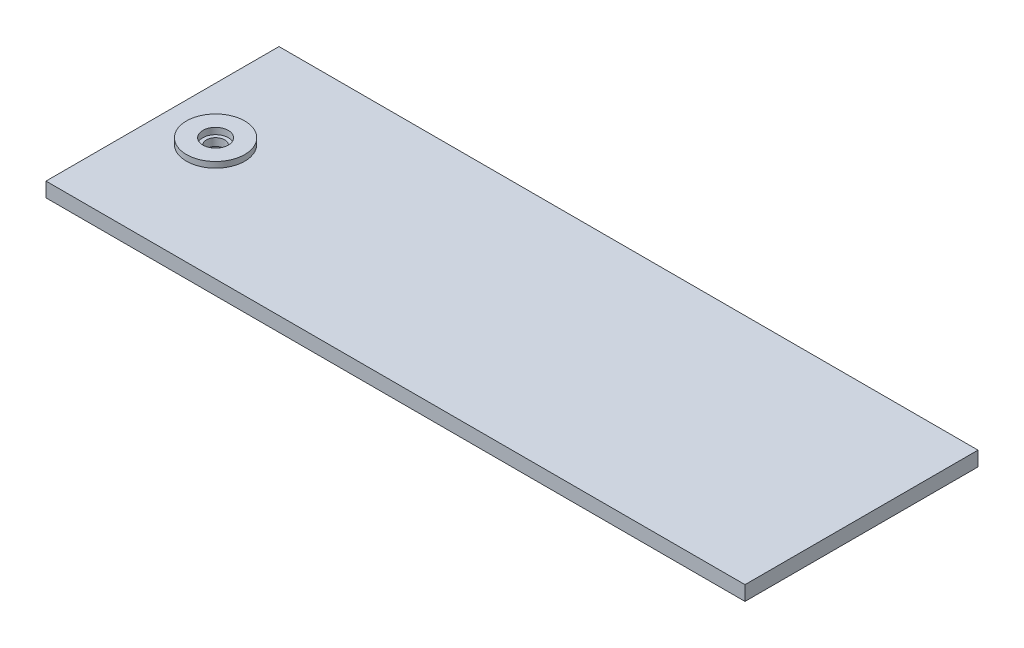
ISO-10303-21;
HEADER;
FILE_DESCRIPTION(('STEP AP214'),'2;1');
FILE_NAME('part.step','',(''),(''),'','','');
FILE_SCHEMA(('AUTOMOTIVE_DESIGN { 1 0 10303 214 1 1 1 1 }'));
ENDSEC;
DATA;
#1=APPLICATION_CONTEXT('core data for automotive mechanical design processes');
#2=APPLICATION_PROTOCOL_DEFINITION('international standard','automotive_design',2000,#1);
#3=PRODUCT_CONTEXT('',#1,'mechanical');
#4=PRODUCT('Part','Part','',(#3));
#5=PRODUCT_RELATED_PRODUCT_CATEGORY('part','',(#4));
#6=PRODUCT_DEFINITION_FORMATION('','',#4);
#7=PRODUCT_DEFINITION_CONTEXT('part definition',#1,'design');
#8=PRODUCT_DEFINITION('design','',#6,#7);
#9=PRODUCT_DEFINITION_SHAPE('','',#8);
#10=(LENGTH_UNIT() NAMED_UNIT(*) SI_UNIT(.MILLI.,.METRE.));
#11=(NAMED_UNIT(*) PLANE_ANGLE_UNIT() SI_UNIT($,.RADIAN.));
#12=(NAMED_UNIT(*) SI_UNIT($,.STERADIAN.) SOLID_ANGLE_UNIT());
#13=UNCERTAINTY_MEASURE_WITH_UNIT(LENGTH_MEASURE(1.E-05),#10,'distance_accuracy_value','');
#14=(GEOMETRIC_REPRESENTATION_CONTEXT(3) GLOBAL_UNCERTAINTY_ASSIGNED_CONTEXT((#13)) GLOBAL_UNIT_ASSIGNED_CONTEXT((#10,
#11,#12)) REPRESENTATION_CONTEXT('',''));
#15=CARTESIAN_POINT('',(0.,0.,0.));
#16=DIRECTION('',(0.,0.,1.));
#17=DIRECTION('',(1.,0.,0.));
#18=AXIS2_PLACEMENT_3D('',#15,#16,#17);
#19=CARTESIAN_POINT('',(304.8,12.7,101.6));
#20=DIRECTION('',(-1.,0.,0.));
#21=DIRECTION('',(0.,0.,1.));
#22=AXIS2_PLACEMENT_3D('',#19,#20,#21);
#23=PLANE('',#22);
#24=DIRECTION('',(0.,0.,-1.));
#25=VECTOR('',#24,1.);
#26=CARTESIAN_POINT('',(304.8,0.,101.6));
#27=LINE('',#26,#25);
#28=CARTESIAN_POINT('',(304.8,0.,101.6));
#29=VERTEX_POINT('',#28);
#30=CARTESIAN_POINT('',(304.8,0.,-101.6));
#31=VERTEX_POINT('',#30);
#32=EDGE_CURVE('E111',#29,#31,#27,.T.);
#33=ORIENTED_EDGE('',*,*,#32,.T.);
#34=DIRECTION('',(0.,-1.,0.));
#35=VECTOR('',#34,1.);
#36=CARTESIAN_POINT('',(304.8,12.7,-101.6));
#37=LINE('',#36,#35);
#38=CARTESIAN_POINT('',(304.8,12.7,-101.6));
#39=VERTEX_POINT('',#38);
#40=EDGE_CURVE('E49',#39,#31,#37,.T.);
#41=ORIENTED_EDGE('',*,*,#40,.F.);
#42=DIRECTION('',(0.,0.,-1.));
#43=VECTOR('',#42,1.);
#44=CARTESIAN_POINT('',(304.8,12.7,101.6));
#45=LINE('',#44,#43);
#46=CARTESIAN_POINT('',(304.8,12.7,101.6));
#47=VERTEX_POINT('',#46);
#48=EDGE_CURVE('E93',#47,#39,#45,.T.);
#49=ORIENTED_EDGE('',*,*,#48,.F.);
#50=DIRECTION('',(0.,-1.,0.));
#51=VECTOR('',#50,1.);
#52=CARTESIAN_POINT('',(304.8,12.7,101.6));
#53=LINE('',#52,#51);
#54=EDGE_CURVE('E107',#47,#29,#53,.T.);
#55=ORIENTED_EDGE('',*,*,#54,.T.);
#56=EDGE_LOOP('',(#33,#41,#49,#55));
#57=FACE_BOUND('',#56,.T.);
#58=ADVANCED_FACE('F39',(#57),#23,.F.);
#59=CARTESIAN_POINT('',(-304.8,12.7,-101.6));
#60=DIRECTION('',(0.,0.,1.));
#61=DIRECTION('',(1.,0.,0.));
#62=AXIS2_PLACEMENT_3D('',#59,#60,#61);
#63=PLANE('',#62);
#64=DIRECTION('',(-1.,0.,0.));
#65=VECTOR('',#64,1.);
#66=CARTESIAN_POINT('',(-304.8,0.,-101.6));
#67=LINE('',#66,#65);
#68=CARTESIAN_POINT('',(-304.8,0.,-101.6));
#69=VERTEX_POINT('',#68);
#70=EDGE_CURVE('E99',#31,#69,#67,.T.);
#71=ORIENTED_EDGE('',*,*,#70,.T.);
#72=DIRECTION('',(0.,-1.,0.));
#73=VECTOR('',#72,1.);
#74=CARTESIAN_POINT('',(-304.8,12.7,-101.6));
#75=LINE('',#74,#73);
#76=CARTESIAN_POINT('',(-304.8,12.7,-101.6));
#77=VERTEX_POINT('',#76);
#78=EDGE_CURVE('E97',#77,#69,#75,.T.);
#79=ORIENTED_EDGE('',*,*,#78,.F.);
#80=DIRECTION('',(-1.,0.,0.));
#81=VECTOR('',#80,1.);
#82=CARTESIAN_POINT('',(-304.8,12.7,-101.6));
#83=LINE('',#82,#81);
#84=EDGE_CURVE('E88',#39,#77,#83,.T.);
#85=ORIENTED_EDGE('',*,*,#84,.F.);
#86=ORIENTED_EDGE('',*,*,#40,.T.);
#87=EDGE_LOOP('',(#71,#79,#85,#86));
#88=FACE_BOUND('',#87,.T.);
#89=ADVANCED_FACE('F98',(#88),#63,.F.);
#90=CARTESIAN_POINT('',(-304.8,12.7,101.6));
#91=DIRECTION('',(1.,0.,0.));
#92=DIRECTION('',(0.,0.,-1.));
#93=AXIS2_PLACEMENT_3D('',#90,#91,#92);
#94=PLANE('',#93);
#95=DIRECTION('',(0.,0.,1.));
#96=VECTOR('',#95,1.);
#97=CARTESIAN_POINT('',(-304.8,0.,101.6));
#98=LINE('',#97,#96);
#99=CARTESIAN_POINT('',(-304.8,0.,101.6));
#100=VERTEX_POINT('',#99);
#101=EDGE_CURVE('E74',#69,#100,#98,.T.);
#102=ORIENTED_EDGE('',*,*,#101,.T.);
#103=DIRECTION('',(0.,-1.,0.));
#104=VECTOR('',#103,1.);
#105=CARTESIAN_POINT('',(-304.8,12.7,101.6));
#106=LINE('',#105,#104);
#107=CARTESIAN_POINT('',(-304.8,12.7,101.6));
#108=VERTEX_POINT('',#107);
#109=EDGE_CURVE('E101',#108,#100,#106,.T.);
#110=ORIENTED_EDGE('',*,*,#109,.F.);
#111=DIRECTION('',(0.,0.,1.));
#112=VECTOR('',#111,1.);
#113=CARTESIAN_POINT('',(-304.8,12.7,101.6));
#114=LINE('',#113,#112);
#115=EDGE_CURVE('E91',#77,#108,#114,.T.);
#116=ORIENTED_EDGE('',*,*,#115,.F.);
#117=ORIENTED_EDGE('',*,*,#78,.T.);
#118=EDGE_LOOP('',(#102,#110,#116,#117));
#119=FACE_BOUND('',#118,.T.);
#120=ADVANCED_FACE('F103',(#119),#94,.F.);
#121=CARTESIAN_POINT('',(-304.8,12.7,101.6));
#122=DIRECTION('',(0.,0.,-1.));
#123=DIRECTION('',(-1.,0.,0.));
#124=AXIS2_PLACEMENT_3D('',#121,#122,#123);
#125=PLANE('',#124);
#126=DIRECTION('',(1.,0.,0.));
#127=VECTOR('',#126,1.);
#128=CARTESIAN_POINT('',(-304.8,0.,101.6));
#129=LINE('',#128,#127);
#130=EDGE_CURVE('E80',#100,#29,#129,.T.);
#131=ORIENTED_EDGE('',*,*,#130,.T.);
#132=ORIENTED_EDGE('',*,*,#54,.F.);
#133=DIRECTION('',(1.,0.,0.));
#134=VECTOR('',#133,1.);
#135=CARTESIAN_POINT('',(-304.8,12.7,101.6));
#136=LINE('',#135,#134);
#137=EDGE_CURVE('E57',#108,#47,#136,.T.);
#138=ORIENTED_EDGE('',*,*,#137,.F.);
#139=ORIENTED_EDGE('',*,*,#109,.T.);
#140=EDGE_LOOP('',(#131,#132,#138,#139));
#141=FACE_BOUND('',#140,.T.);
#142=ADVANCED_FACE('F142',(#141),#125,.F.);
#143=CARTESIAN_POINT('',(0.,12.7,0.));
#144=DIRECTION('',(0.,-1.,0.));
#145=DIRECTION('',(0.,0.,-1.));
#146=AXIS2_PLACEMENT_3D('',#143,#144,#145);
#147=PLANE('',#146);
#148=CARTESIAN_POINT('',(-258.510557856653,12.7,0.));
#149=DIRECTION('',(0.,-1.,0.));
#150=DIRECTION('',(0.,0.,-1.));
#151=AXIS2_PLACEMENT_3D('',#148,#149,#150);
#152=CIRCLE('',#151,25.4);
#153=CARTESIAN_POINT('',(-258.510557856653,12.7,-25.4));
#154=VERTEX_POINT('',#153);
#155=EDGE_CURVE('E11',#154,#154,#152,.F.);
#156=ORIENTED_EDGE('',*,*,#155,.F.);
#157=EDGE_LOOP('',(#156));
#158=FACE_BOUND('',#157,.T.);
#159=ORIENTED_EDGE('',*,*,#48,.T.);
#160=ORIENTED_EDGE('',*,*,#84,.T.);
#161=ORIENTED_EDGE('',*,*,#115,.T.);
#162=ORIENTED_EDGE('',*,*,#137,.T.);
#163=EDGE_LOOP('',(#159,#160,#161,#162));
#164=FACE_BOUND('',#163,.T.);
#165=ADVANCED_FACE('F89',(#158,#164),#147,.F.);
#166=CARTESIAN_POINT('',(0.,0.,0.));
#167=DIRECTION('',(0.,-1.,0.));
#168=DIRECTION('',(0.,0.,-1.));
#169=AXIS2_PLACEMENT_3D('',#166,#167,#168);
#170=PLANE('',#169);
#171=CARTESIAN_POINT('',(-258.510557856653,0.,0.));
#172=DIRECTION('',(0.,-1.,0.));
#173=DIRECTION('',(0.,0.,-1.));
#174=AXIS2_PLACEMENT_3D('',#171,#172,#173);
#175=CIRCLE('',#174,11.1125);
#176=CARTESIAN_POINT('',(-258.510557856653,0.,-11.1125));
#177=VERTEX_POINT('',#176);
#178=EDGE_CURVE('E246',#177,#177,#175,.T.);
#179=ORIENTED_EDGE('',*,*,#178,.F.);
#180=EDGE_LOOP('',(#179));
#181=FACE_BOUND('',#180,.T.);
#182=ORIENTED_EDGE('',*,*,#32,.F.);
#183=ORIENTED_EDGE('',*,*,#130,.F.);
#184=ORIENTED_EDGE('',*,*,#101,.F.);
#185=ORIENTED_EDGE('',*,*,#70,.F.);
#186=EDGE_LOOP('',(#182,#183,#184,#185));
#187=FACE_BOUND('',#186,.T.);
#188=ADVANCED_FACE('F130',(#181,#187),#170,.T.);
#189=CARTESIAN_POINT('',(-258.510557856653,17.78,0.));
#190=DIRECTION('',(0.,-1.,0.));
#191=DIRECTION('',(0.,0.,-1.));
#192=AXIS2_PLACEMENT_3D('',#189,#190,#191);
#193=CYLINDRICAL_SURFACE('',#192,25.4);
#194=CARTESIAN_POINT('',(-258.510557856653,17.78,0.));
#195=DIRECTION('',(0.,1.,0.));
#196=DIRECTION('',(0.,0.,1.));
#197=AXIS2_PLACEMENT_3D('',#194,#195,#196);
#198=CIRCLE('',#197,25.4);
#199=CARTESIAN_POINT('',(-258.510557856653,17.78,25.4));
#200=VERTEX_POINT('',#199);
#201=EDGE_CURVE('E115',#200,#200,#198,.T.);
#202=ORIENTED_EDGE('',*,*,#201,.F.);
#203=EDGE_LOOP('',(#202));
#204=FACE_BOUND('',#203,.T.);
#205=ORIENTED_EDGE('',*,*,#155,.T.);
#206=EDGE_LOOP('',(#205));
#207=FACE_BOUND('',#206,.T.);
#208=ADVANCED_FACE('F132',(#204,#207),#193,.T.);
#209=CARTESIAN_POINT('',(-258.510557856653,17.78,0.));
#210=DIRECTION('',(0.,1.,0.));
#211=DIRECTION('',(0.,0.,1.));
#212=AXIS2_PLACEMENT_3D('',#209,#210,#211);
#213=PLANE('',#212);
#214=CARTESIAN_POINT('',(-258.510557856653,17.78,0.));
#215=DIRECTION('',(0.,1.,0.));
#216=DIRECTION('',(0.,0.,1.));
#217=AXIS2_PLACEMENT_3D('',#214,#215,#216);
#218=CIRCLE('',#217,11.1125);
#219=CARTESIAN_POINT('',(-258.510557856653,17.78,11.1125));
#220=VERTEX_POINT('',#219);
#221=EDGE_CURVE('E252',#220,#220,#218,.T.);
#222=ORIENTED_EDGE('',*,*,#221,.F.);
#223=EDGE_LOOP('',(#222));
#224=FACE_BOUND('',#223,.T.);
#225=ORIENTED_EDGE('',*,*,#201,.T.);
#226=EDGE_LOOP('',(#225));
#227=FACE_BOUND('',#226,.T.);
#228=ADVANCED_FACE('F139',(#224,#227),#213,.T.);
#229=CARTESIAN_POINT('',(-258.510557856653,12.22375,0.));
#230=DIRECTION('',(0.,1.,0.));
#231=DIRECTION('',(0.,0.,1.));
#232=AXIS2_PLACEMENT_3D('',#229,#230,#231);
#233=CYLINDRICAL_SURFACE('',#232,11.1125);
#234=CARTESIAN_POINT('',(-258.510557856653,12.22375,0.));
#235=DIRECTION('',(0.,1.,0.));
#236=DIRECTION('',(0.,0.,1.));
#237=AXIS2_PLACEMENT_3D('',#234,#235,#236);
#238=CIRCLE('',#237,11.1125);
#239=CARTESIAN_POINT('',(-258.510557856653,12.22375,11.1125));
#240=VERTEX_POINT('',#239);
#241=EDGE_CURVE('E256',#240,#240,#238,.T.);
#242=ORIENTED_EDGE('',*,*,#241,.F.);
#243=EDGE_LOOP('',(#242));
#244=FACE_BOUND('',#243,.T.);
#245=ORIENTED_EDGE('',*,*,#221,.T.);
#246=EDGE_LOOP('',(#245));
#247=FACE_BOUND('',#246,.T.);
#248=ADVANCED_FACE('F180',(#244,#247),#233,.F.);
#249=CARTESIAN_POINT('',(-258.510557856653,12.22375,0.));
#250=DIRECTION('',(0.,1.,0.));
#251=DIRECTION('',(0.,0.,1.));
#252=AXIS2_PLACEMENT_3D('',#249,#250,#251);
#253=PLANE('',#252);
#254=CARTESIAN_POINT('',(-258.510557856653,12.22375,0.));
#255=DIRECTION('',(0.,1.,0.));
#256=DIRECTION('',(0.,0.,1.));
#257=AXIS2_PLACEMENT_3D('',#254,#255,#256);
#258=CIRCLE('',#257,7.93749999999998);
#259=CARTESIAN_POINT('',(-258.510557856653,12.22375,7.93749999999998));
#260=VERTEX_POINT('',#259);
#261=EDGE_CURVE('E242',#260,#260,#258,.T.);
#262=ORIENTED_EDGE('',*,*,#261,.F.);
#263=EDGE_LOOP('',(#262));
#264=FACE_BOUND('',#263,.T.);
#265=ORIENTED_EDGE('',*,*,#241,.T.);
#266=EDGE_LOOP('',(#265));
#267=FACE_BOUND('',#266,.T.);
#268=ADVANCED_FACE('F189',(#264,#267),#253,.T.);
#269=CARTESIAN_POINT('',(-258.510557856653,5.55625,0.));
#270=DIRECTION('',(0.,-1.,0.));
#271=DIRECTION('',(0.,0.,-1.));
#272=AXIS2_PLACEMENT_3D('',#269,#270,#271);
#273=CYLINDRICAL_SURFACE('',#272,11.1125);
#274=CARTESIAN_POINT('',(-258.510557856653,5.55625,0.));
#275=DIRECTION('',(0.,-1.,0.));
#276=DIRECTION('',(0.,0.,-1.));
#277=AXIS2_PLACEMENT_3D('',#274,#275,#276);
#278=CIRCLE('',#277,11.1125);
#279=CARTESIAN_POINT('',(-258.510557856653,5.55625,-11.1125));
#280=VERTEX_POINT('',#279);
#281=EDGE_CURVE('E248',#280,#280,#278,.T.);
#282=ORIENTED_EDGE('',*,*,#281,.F.);
#283=EDGE_LOOP('',(#282));
#284=FACE_BOUND('',#283,.T.);
#285=ORIENTED_EDGE('',*,*,#178,.T.);
#286=EDGE_LOOP('',(#285));
#287=FACE_BOUND('',#286,.T.);
#288=ADVANCED_FACE('F201',(#284,#287),#273,.F.);
#289=CARTESIAN_POINT('',(-258.510557856653,5.55625,0.));
#290=DIRECTION('',(0.,-1.,0.));
#291=DIRECTION('',(0.,0.,-1.));
#292=AXIS2_PLACEMENT_3D('',#289,#290,#291);
#293=PLANE('',#292);
#294=CARTESIAN_POINT('',(-258.510557856653,5.55625,0.));
#295=DIRECTION('',(0.,-1.,0.));
#296=DIRECTION('',(0.,0.,-1.));
#297=AXIS2_PLACEMENT_3D('',#294,#295,#296);
#298=CIRCLE('',#297,7.93749999999998);
#299=CARTESIAN_POINT('',(-258.510557856653,5.55625,7.93749999999998));
#300=VERTEX_POINT('',#299);
#301=EDGE_CURVE('E42',#300,#300,#298,.T.);
#302=ORIENTED_EDGE('',*,*,#301,.F.);
#303=EDGE_LOOP('',(#302));
#304=FACE_BOUND('',#303,.T.);
#305=ORIENTED_EDGE('',*,*,#281,.T.);
#306=EDGE_LOOP('',(#305));
#307=FACE_BOUND('',#306,.T.);
#308=ADVANCED_FACE('F206',(#304,#307),#293,.T.);
#309=CARTESIAN_POINT('',(-258.510557856653,0.,0.));
#310=DIRECTION('',(0.,1.,0.));
#311=DIRECTION('',(0.,0.,1.));
#312=AXIS2_PLACEMENT_3D('',#309,#310,#311);
#313=CYLINDRICAL_SURFACE('',#312,7.93749999999998);
#314=CARTESIAN_POINT('',(-258.510557856653,5.55625,7.93749999999998));
#315=CARTESIAN_POINT('',(-258.510557856653,5.625703125,7.93749999999998));
#316=CARTESIAN_POINT('',(-258.510557856653,5.69515625,7.93749999999998));
#317=CARTESIAN_POINT('',(-258.510557856653,5.8340625,7.93749999999998));
#318=CARTESIAN_POINT('',(-258.510557856653,5.903515625,7.93749999999998));
#319=CARTESIAN_POINT('',(-258.510557856653,6.042421875,7.93749999999998));
#320=CARTESIAN_POINT('',(-258.510557856653,6.111875,7.93749999999998));
#321=CARTESIAN_POINT('',(-258.510557856653,6.25078125,7.93749999999998));
#322=CARTESIAN_POINT('',(-258.510557856653,6.320234375,7.93749999999998));
#323=CARTESIAN_POINT('',(-258.510557856653,6.459140625,7.93749999999998));
#324=CARTESIAN_POINT('',(-258.510557856653,6.52859375,7.93749999999998));
#325=CARTESIAN_POINT('',(-258.510557856653,6.6675,7.93749999999998));
#326=CARTESIAN_POINT('',(-258.510557856653,6.736953125,7.93749999999998));
#327=CARTESIAN_POINT('',(-258.510557856653,6.875859375,7.93749999999998));
#328=CARTESIAN_POINT('',(-258.510557856653,6.9453125,7.93749999999998));
#329=CARTESIAN_POINT('',(-258.510557856653,7.08421875,7.93749999999998));
#330=CARTESIAN_POINT('',(-258.510557856653,7.153671875,7.93749999999998));
#331=CARTESIAN_POINT('',(-258.510557856653,7.292578125,7.93749999999998));
#332=CARTESIAN_POINT('',(-258.510557856653,7.36203125,7.93749999999998));
#333=CARTESIAN_POINT('',(-258.510557856653,7.5009375,7.93749999999998));
#334=CARTESIAN_POINT('',(-258.510557856653,7.570390625,7.93749999999998));
#335=CARTESIAN_POINT('',(-258.510557856653,7.709296875,7.93749999999998));
#336=CARTESIAN_POINT('',(-258.510557856653,7.77875,7.93749999999998));
#337=CARTESIAN_POINT('',(-258.510557856653,7.91765625,7.93749999999998));
#338=CARTESIAN_POINT('',(-258.510557856653,7.987109375,7.93749999999998));
#339=CARTESIAN_POINT('',(-258.510557856653,8.126015625,7.93749999999998));
#340=CARTESIAN_POINT('',(-258.510557856653,8.19546875,7.93749999999998));
#341=CARTESIAN_POINT('',(-258.510557856653,8.334375,7.93749999999998));
#342=CARTESIAN_POINT('',(-258.510557856653,8.403828125,7.93749999999998));
#343=CARTESIAN_POINT('',(-258.510557856653,8.542734375,7.93749999999998));
#344=CARTESIAN_POINT('',(-258.510557856653,8.6121875,7.93749999999998));
#345=CARTESIAN_POINT('',(-258.510557856653,8.75109375,7.93749999999998));
#346=CARTESIAN_POINT('',(-258.510557856653,8.820546875,7.93749999999998));
#347=CARTESIAN_POINT('',(-258.510557856653,8.959453125,7.93749999999998));
#348=CARTESIAN_POINT('',(-258.510557856653,9.02890625,7.93749999999998));
#349=CARTESIAN_POINT('',(-258.510557856653,9.1678125,7.93749999999998));
#350=CARTESIAN_POINT('',(-258.510557856653,9.237265625,7.93749999999998));
#351=CARTESIAN_POINT('',(-258.510557856653,9.376171875,7.93749999999998));
#352=CARTESIAN_POINT('',(-258.510557856653,9.445625,7.93749999999998));
#353=CARTESIAN_POINT('',(-258.510557856653,9.58453125,7.93749999999998));
#354=CARTESIAN_POINT('',(-258.510557856653,9.653984375,7.93749999999998));
#355=CARTESIAN_POINT('',(-258.510557856653,9.792890625,7.93749999999998));
#356=CARTESIAN_POINT('',(-258.510557856653,9.86234375,7.93749999999998));
#357=CARTESIAN_POINT('',(-258.510557856653,10.00125,7.93749999999998));
#358=CARTESIAN_POINT('',(-258.510557856653,10.070703125,7.93749999999998));
#359=CARTESIAN_POINT('',(-258.510557856653,10.209609375,7.93749999999998));
#360=CARTESIAN_POINT('',(-258.510557856653,10.2790625,7.93749999999998));
#361=CARTESIAN_POINT('',(-258.510557856653,10.41796875,7.93749999999998));
#362=CARTESIAN_POINT('',(-258.510557856653,10.487421875,7.93749999999998));
#363=CARTESIAN_POINT('',(-258.510557856653,10.626328125,7.93749999999998));
#364=CARTESIAN_POINT('',(-258.510557856653,10.69578125,7.93749999999998));
#365=CARTESIAN_POINT('',(-258.510557856653,10.8346875,7.93749999999998));
#366=CARTESIAN_POINT('',(-258.510557856653,10.904140625,7.93749999999998));
#367=CARTESIAN_POINT('',(-258.510557856653,11.043046875,7.93749999999998));
#368=CARTESIAN_POINT('',(-258.510557856653,11.1125,7.93749999999998));
#369=CARTESIAN_POINT('',(-258.510557856653,11.25140625,7.93749999999998));
#370=CARTESIAN_POINT('',(-258.510557856653,11.320859375,7.93749999999998));
#371=CARTESIAN_POINT('',(-258.510557856653,11.459765625,7.93749999999998));
#372=CARTESIAN_POINT('',(-258.510557856653,11.52921875,7.93749999999998));
#373=CARTESIAN_POINT('',(-258.510557856653,11.668125,7.93749999999998));
#374=CARTESIAN_POINT('',(-258.510557856653,11.737578125,7.93749999999998));
#375=CARTESIAN_POINT('',(-258.510557856653,11.876484375,7.93749999999998));
#376=CARTESIAN_POINT('',(-258.510557856653,11.9459375,7.93749999999998));
#377=CARTESIAN_POINT('',(-258.510557856653,12.08484375,7.93749999999998));
#378=CARTESIAN_POINT('',(-258.510557856653,12.154296875,7.93749999999998));
#379=CARTESIAN_POINT('',(-258.510557856653,12.22375,7.93749999999998));
#380=B_SPLINE_CURVE_WITH_KNOTS('',3,(#314,#315,#316,#317,#318,#319,#320,#321,#322,#323,#324,
#325,#326,#327,#328,#329,#330,#331,#332,#333,#334,#335,#336,#337,#338,#339,#340,#341,#342,#343,
#344,#345,#346,#347,#348,#349,#350,#351,#352,#353,#354,#355,#356,#357,#358,#359,#360,#361,#362,
#363,#364,#365,#366,#367,#368,#369,#370,#371,#372,#373,#374,#375,#376,#377,#378,#379),
.UNSPECIFIED.,.F.,.F.,(4,2,2,2,2,2,2,2,2,2,2,2,2,2,2,2,2,2,2,2,2,2,2,2,2,2,2,2,2,2,2,2,4),(0.,
0.208359375,0.41671875,0.625078125,0.8334375,1.041796875,1.25015625,1.458515625,1.666875,
1.875234375,2.08359375,2.291953125,2.5003125,2.708671875,2.91703125,3.125390625,3.33375,
3.542109375,3.75046875,3.958828125,4.1671875,4.375546875,4.58390625,4.792265625,5.000625,
5.208984375,5.41734375,5.625703125,5.8340625,6.042421875,6.25078125,6.459140625,6.6675),.UNSPECIFIED.);
#381=EDGE_CURVE('BSEAM223',#300,#260,#380,.T.);
#382=ORIENTED_EDGE('',*,*,#301,.T.);
#383=ORIENTED_EDGE('',*,*,#261,.T.);
#384=ORIENTED_EDGE('',*,*,#381,.T.);
#385=ORIENTED_EDGE('',*,*,#381,.F.);
#386=EDGE_LOOP('',(#382,#384,#383,#385));
#387=FACE_BOUND('',#386,.T.);
#388=ADVANCED_FACE('F223',(#387),#313,.F.);
#389=CLOSED_SHELL('',(#58,#89,#120,#142,#165,#188,#208,#228,#248,#268,#288,#308,#388));
#390=MANIFOLD_SOLID_BREP('B2',#389);
#391=ADVANCED_BREP_SHAPE_REPRESENTATION('',(#18,#390),#14);
#392=SHAPE_DEFINITION_REPRESENTATION(#9,#391);
ENDSEC;
END-ISO-10303-21;
